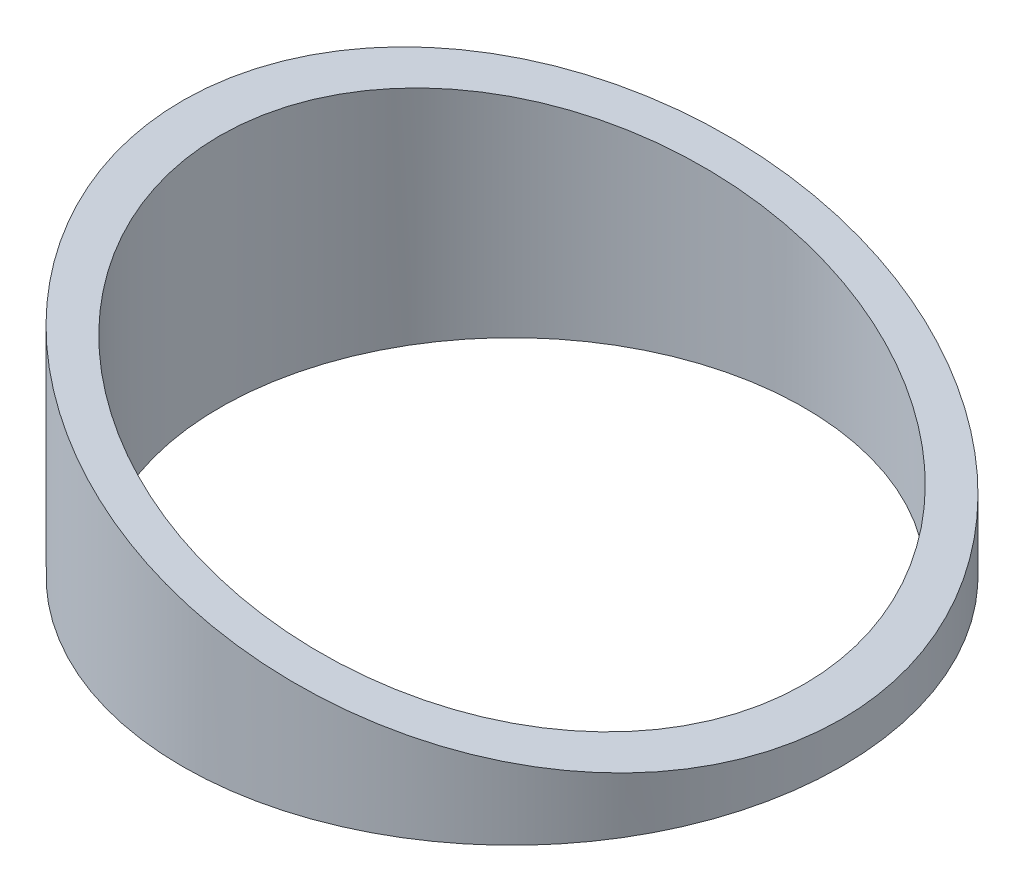
ISO-10303-21;
HEADER;
FILE_DESCRIPTION(('STEP AP214'),'2;1');
FILE_NAME('part.step','',(''),(''),'','','');
FILE_SCHEMA(('AUTOMOTIVE_DESIGN { 1 0 10303 214 1 1 1 1 }'));
ENDSEC;
DATA;
#1=APPLICATION_CONTEXT('core data for automotive mechanical design processes');
#2=APPLICATION_PROTOCOL_DEFINITION('international standard','automotive_design',2000,#1);
#3=PRODUCT_CONTEXT('',#1,'mechanical');
#4=PRODUCT('Part','Part','',(#3));
#5=PRODUCT_RELATED_PRODUCT_CATEGORY('part','',(#4));
#6=PRODUCT_DEFINITION_FORMATION('','',#4);
#7=PRODUCT_DEFINITION_CONTEXT('part definition',#1,'design');
#8=PRODUCT_DEFINITION('design','',#6,#7);
#9=PRODUCT_DEFINITION_SHAPE('','',#8);
#10=(LENGTH_UNIT() NAMED_UNIT(*) SI_UNIT(.MILLI.,.METRE.));
#11=(NAMED_UNIT(*) PLANE_ANGLE_UNIT() SI_UNIT($,.RADIAN.));
#12=(NAMED_UNIT(*) SI_UNIT($,.STERADIAN.) SOLID_ANGLE_UNIT());
#13=UNCERTAINTY_MEASURE_WITH_UNIT(LENGTH_MEASURE(1.E-05),#10,'distance_accuracy_value','');
#14=(GEOMETRIC_REPRESENTATION_CONTEXT(3) GLOBAL_UNCERTAINTY_ASSIGNED_CONTEXT((#13)) GLOBAL_UNIT_ASSIGNED_CONTEXT((#10,
#11,#12)) REPRESENTATION_CONTEXT('',''));
#15=CARTESIAN_POINT('',(0.,0.,0.));
#16=DIRECTION('',(0.,0.,1.));
#17=DIRECTION('',(1.,0.,0.));
#18=AXIS2_PLACEMENT_3D('',#15,#16,#17);
#19=CARTESIAN_POINT('',(0.,0.,0.));
#20=DIRECTION('',(0.,1.,0.));
#21=DIRECTION('',(0.,0.,1.));
#22=AXIS2_PLACEMENT_3D('',#19,#20,#21);
#23=PLANE('',#22);
#24=CARTESIAN_POINT('',(0.,0.,0.));
#25=DIRECTION('',(0.,1.,0.));
#26=DIRECTION('',(0.,0.,1.));
#27=AXIS2_PLACEMENT_3D('',#24,#25,#26);
#28=CIRCLE('',#27,26.5);
#29=CARTESIAN_POINT('',(0.,0.,26.5));
#30=VERTEX_POINT('',#29);
#31=EDGE_CURVE('E10',#30,#30,#28,.T.);
#32=ORIENTED_EDGE('',*,*,#31,.F.);
#33=EDGE_LOOP('',(#32));
#34=FACE_BOUND('',#33,.T.);
#35=CARTESIAN_POINT('',(0.,0.,0.));
#36=DIRECTION('',(0.,1.,0.));
#37=DIRECTION('',(0.,0.,1.));
#38=AXIS2_PLACEMENT_3D('',#35,#36,#37);
#39=CIRCLE('',#38,23.5);
#40=CARTESIAN_POINT('',(0.,0.,23.5));
#41=VERTEX_POINT('',#40);
#42=EDGE_CURVE('E40',#41,#41,#39,.T.);
#43=ORIENTED_EDGE('',*,*,#42,.T.);
#44=EDGE_LOOP('',(#43));
#45=FACE_BOUND('',#44,.T.);
#46=ADVANCED_FACE('F32',(#34,#45),#23,.F.);
#47=CARTESIAN_POINT('',(0.,20.,0.));
#48=DIRECTION('',(0.,-1.,0.));
#49=DIRECTION('',(0.,0.,-1.));
#50=AXIS2_PLACEMENT_3D('',#47,#48,#49);
#51=CYLINDRICAL_SURFACE('',#50,26.5);
#52=CARTESIAN_POINT('',(0.,11.5850607269895,0.));
#53=DIRECTION('',(-0.298539846101388,-0.954397171145095,0.));
#54=DIRECTION('',(0.954397171145095,-0.298539846101388,0.));
#55=AXIS2_PLACEMENT_3D('',#52,#53,#54);
#56=ELLIPSE('',#55,27.7662180915782,26.5);
#57=CARTESIAN_POINT('',(26.5,3.29573825111217,0.));
#58=VERTEX_POINT('',#57);
#59=EDGE_CURVE('E44',#58,#58,#56,.T.);
#60=ORIENTED_EDGE('',*,*,#59,.T.);
#61=EDGE_LOOP('',(#60));
#62=FACE_BOUND('',#61,.T.);
#63=ORIENTED_EDGE('',*,*,#31,.T.);
#64=EDGE_LOOP('',(#63));
#65=FACE_BOUND('',#64,.T.);
#66=ADVANCED_FACE('F34',(#62,#65),#51,.T.);
#67=CARTESIAN_POINT('',(0.,20.,0.));
#68=DIRECTION('',(0.,-1.,0.));
#69=DIRECTION('',(0.,0.,-1.));
#70=AXIS2_PLACEMENT_3D('',#67,#68,#69);
#71=CYLINDRICAL_SURFACE('',#70,23.5);
#72=CARTESIAN_POINT('',(0.,11.5850607269895,0.));
#73=DIRECTION('',(-0.298539846101388,-0.954397171145095,0.));
#74=DIRECTION('',(0.954397171145095,-0.298539846101388,0.));
#75=AXIS2_PLACEMENT_3D('',#72,#73,#74);
#76=ELLIPSE('',#75,24.6228726472486,23.5);
#77=CARTESIAN_POINT('',(23.5,4.23415211630583,0.));
#78=VERTEX_POINT('',#77);
#79=EDGE_CURVE('E36',#78,#78,#76,.T.);
#80=ORIENTED_EDGE('',*,*,#79,.F.);
#81=EDGE_LOOP('',(#80));
#82=FACE_BOUND('',#81,.T.);
#83=ORIENTED_EDGE('',*,*,#42,.F.);
#84=EDGE_LOOP('',(#83));
#85=FACE_BOUND('',#84,.T.);
#86=ADVANCED_FACE('F56',(#82,#85),#71,.F.);
#87=CARTESIAN_POINT('',(29.1336386231222,2.47192391782969,-26.5));
#88=DIRECTION('',(-0.298539846101388,-0.954397171145095,0.));
#89=DIRECTION('',(0.954397171145095,-0.298539846101388,0.));
#90=AXIS2_PLACEMENT_3D('',#87,#88,#89);
#91=PLANE('',#90);
#92=ORIENTED_EDGE('',*,*,#79,.T.);
#93=EDGE_LOOP('',(#92));
#94=FACE_BOUND('',#93,.T.);
#95=ORIENTED_EDGE('',*,*,#59,.F.);
#96=EDGE_LOOP('',(#95));
#97=FACE_BOUND('',#96,.T.);
#98=ADVANCED_FACE('F53',(#94,#97),#91,.F.);
#99=CLOSED_SHELL('',(#46,#66,#86,#98));
#100=MANIFOLD_SOLID_BREP('B2',#99);
#101=ADVANCED_BREP_SHAPE_REPRESENTATION('',(#18,#100),#14);
#102=SHAPE_DEFINITION_REPRESENTATION(#9,#101);
ENDSEC;
END-ISO-10303-21;
